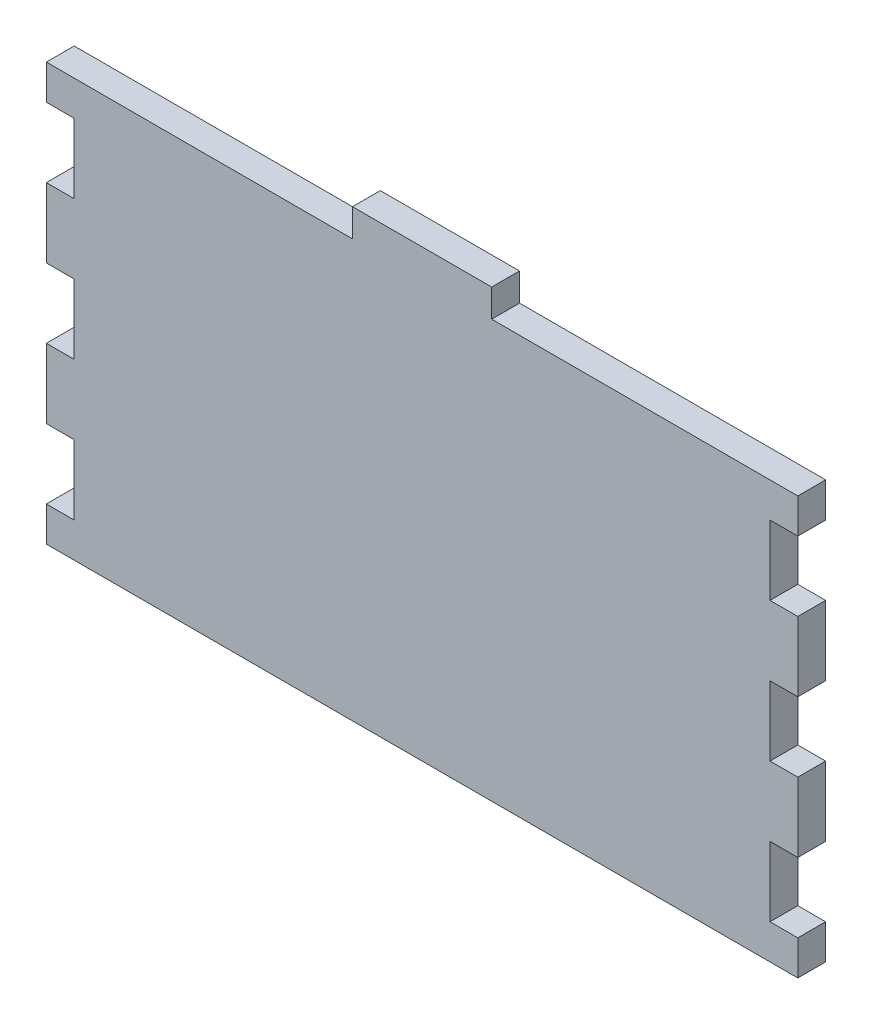
ISO-10303-21;
HEADER;
FILE_DESCRIPTION(('STEP AP214'),'2;1');
FILE_NAME('part.step','',(''),(''),'','','');
FILE_SCHEMA(('AUTOMOTIVE_DESIGN { 1 0 10303 214 1 1 1 1 }'));
ENDSEC;
DATA;
#1=APPLICATION_CONTEXT('core data for automotive mechanical design processes');
#2=APPLICATION_PROTOCOL_DEFINITION('international standard','automotive_design',2000,#1);
#3=PRODUCT_CONTEXT('',#1,'mechanical');
#4=PRODUCT('Part','Part','',(#3));
#5=PRODUCT_RELATED_PRODUCT_CATEGORY('part','',(#4));
#6=PRODUCT_DEFINITION_FORMATION('','',#4);
#7=PRODUCT_DEFINITION_CONTEXT('part definition',#1,'design');
#8=PRODUCT_DEFINITION('design','',#6,#7);
#9=PRODUCT_DEFINITION_SHAPE('','',#8);
#10=(LENGTH_UNIT() NAMED_UNIT(*) SI_UNIT(.MILLI.,.METRE.));
#11=(NAMED_UNIT(*) PLANE_ANGLE_UNIT() SI_UNIT($,.RADIAN.));
#12=(NAMED_UNIT(*) SI_UNIT($,.STERADIAN.) SOLID_ANGLE_UNIT());
#13=UNCERTAINTY_MEASURE_WITH_UNIT(LENGTH_MEASURE(1.E-05),#10,'distance_accuracy_value','');
#14=(GEOMETRIC_REPRESENTATION_CONTEXT(3) GLOBAL_UNCERTAINTY_ASSIGNED_CONTEXT((#13)) GLOBAL_UNIT_ASSIGNED_CONTEXT((#10,
#11,#12)) REPRESENTATION_CONTEXT('',''));
#15=CARTESIAN_POINT('',(0.,0.,0.));
#16=DIRECTION('',(0.,0.,1.));
#17=DIRECTION('',(1.,0.,0.));
#18=AXIS2_PLACEMENT_3D('',#15,#16,#17);
#19=CARTESIAN_POINT('',(0.,30.,4.));
#20=DIRECTION('',(0.,1.,0.));
#21=DIRECTION('',(0.,0.,1.));
#22=AXIS2_PLACEMENT_3D('',#19,#20,#21);
#23=PLANE('',#22);
#24=DIRECTION('',(1.,0.,0.));
#25=VECTOR('',#24,1.);
#26=CARTESIAN_POINT('',(0.,30.,0.));
#27=LINE('',#26,#25);
#28=CARTESIAN_POINT('',(9.99999999999999,30.,0.));
#29=VERTEX_POINT('',#28);
#30=CARTESIAN_POINT('',(54.,30.,0.));
#31=VERTEX_POINT('',#30);
#32=EDGE_CURVE('E396',#29,#31,#27,.T.);
#33=ORIENTED_EDGE('',*,*,#32,.F.);
#34=DIRECTION('',(0.,0.,1.));
#35=VECTOR('',#34,1.);
#36=CARTESIAN_POINT('',(9.99999999999999,30.,0.));
#37=LINE('',#36,#35);
#38=CARTESIAN_POINT('',(9.99999999999999,30.,4.));
#39=VERTEX_POINT('',#38);
#40=EDGE_CURVE('E348',#29,#39,#37,.T.);
#41=ORIENTED_EDGE('',*,*,#40,.T.);
#42=DIRECTION('',(1.,0.,0.));
#43=VECTOR('',#42,1.);
#44=CARTESIAN_POINT('',(0.,30.,4.));
#45=LINE('',#44,#43);
#46=CARTESIAN_POINT('',(54.,30.,4.));
#47=VERTEX_POINT('',#46);
#48=EDGE_CURVE('E303',#39,#47,#45,.T.);
#49=ORIENTED_EDGE('',*,*,#48,.T.);
#50=DIRECTION('',(0.,0.,-1.));
#51=VECTOR('',#50,1.);
#52=CARTESIAN_POINT('',(54.,30.,4.));
#53=LINE('',#52,#51);
#54=EDGE_CURVE('E403',#47,#31,#53,.T.);
#55=ORIENTED_EDGE('',*,*,#54,.T.);
#56=EDGE_LOOP('',(#33,#41,#49,#55));
#57=FACE_BOUND('',#56,.T.);
#58=ADVANCED_FACE('F41',(#57),#23,.T.);
#59=CARTESIAN_POINT('',(0.,-30.,4.));
#60=DIRECTION('',(0.,1.,0.));
#61=DIRECTION('',(0.,0.,1.));
#62=AXIS2_PLACEMENT_3D('',#59,#60,#61);
#63=PLANE('',#62);
#64=DIRECTION('',(1.,0.,0.));
#65=VECTOR('',#64,1.);
#66=CARTESIAN_POINT('',(0.,-30.,0.));
#67=LINE('',#66,#65);
#68=CARTESIAN_POINT('',(-54.,-30.,0.));
#69=VERTEX_POINT('',#68);
#70=CARTESIAN_POINT('',(54.,-30.,0.));
#71=VERTEX_POINT('',#70);
#72=EDGE_CURVE('E363',#69,#71,#67,.T.);
#73=ORIENTED_EDGE('',*,*,#72,.T.);
#74=DIRECTION('',(0.,0.,-1.));
#75=VECTOR('',#74,1.);
#76=CARTESIAN_POINT('',(54.,-30.,4.));
#77=LINE('',#76,#75);
#78=CARTESIAN_POINT('',(54.,-30.,4.));
#79=VERTEX_POINT('',#78);
#80=EDGE_CURVE('E11',#79,#71,#77,.T.);
#81=ORIENTED_EDGE('',*,*,#80,.F.);
#82=DIRECTION('',(1.,0.,0.));
#83=VECTOR('',#82,1.);
#84=CARTESIAN_POINT('',(0.,-30.,4.));
#85=LINE('',#84,#83);
#86=CARTESIAN_POINT('',(-54.,-30.,4.));
#87=VERTEX_POINT('',#86);
#88=EDGE_CURVE('E344',#87,#79,#85,.T.);
#89=ORIENTED_EDGE('',*,*,#88,.F.);
#90=DIRECTION('',(0.,0.,-1.));
#91=VECTOR('',#90,1.);
#92=CARTESIAN_POINT('',(-54.,-30.,4.));
#93=LINE('',#92,#91);
#94=EDGE_CURVE('E66',#87,#69,#93,.T.);
#95=ORIENTED_EDGE('',*,*,#94,.T.);
#96=EDGE_LOOP('',(#73,#81,#89,#95));
#97=FACE_BOUND('',#96,.T.);
#98=ADVANCED_FACE('F43',(#97),#63,.F.);
#99=CARTESIAN_POINT('',(53.9999999999999,1.49880108324396E-13,4.));
#100=DIRECTION('',(-1.,0.,0.));
#101=DIRECTION('',(0.,-1.,0.));
#102=AXIS2_PLACEMENT_3D('',#99,#100,#101);
#103=PLANE('',#102);
#104=DIRECTION('',(0.,1.,0.));
#105=VECTOR('',#104,1.);
#106=CARTESIAN_POINT('',(53.9999999999999,1.49880108324396E-13,0.));
#107=LINE('',#106,#105);
#108=CARTESIAN_POINT('',(54.,-25.,0.));
#109=VERTEX_POINT('',#108);
#110=EDGE_CURVE('E540',#71,#109,#107,.T.);
#111=ORIENTED_EDGE('',*,*,#110,.T.);
#112=DIRECTION('',(0.,0.,-1.));
#113=VECTOR('',#112,1.);
#114=CARTESIAN_POINT('',(54.,-25.,4.));
#115=LINE('',#114,#113);
#116=CARTESIAN_POINT('',(54.,-25.,4.));
#117=VERTEX_POINT('',#116);
#118=EDGE_CURVE('E50',#117,#109,#115,.T.);
#119=ORIENTED_EDGE('',*,*,#118,.F.);
#120=DIRECTION('',(0.,1.,0.));
#121=VECTOR('',#120,1.);
#122=CARTESIAN_POINT('',(53.9999999999999,1.49880108324396E-13,4.));
#123=LINE('',#122,#121);
#124=EDGE_CURVE('E165',#79,#117,#123,.T.);
#125=ORIENTED_EDGE('',*,*,#124,.F.);
#126=ORIENTED_EDGE('',*,*,#80,.T.);
#127=EDGE_LOOP('',(#111,#119,#125,#126));
#128=FACE_BOUND('',#127,.T.);
#129=ADVANCED_FACE('F541',(#128),#103,.F.);
#130=CARTESIAN_POINT('',(0.,-25.,4.));
#131=DIRECTION('',(0.,1.,0.));
#132=DIRECTION('',(0.,0.,1.));
#133=AXIS2_PLACEMENT_3D('',#130,#131,#132);
#134=PLANE('',#133);
#135=DIRECTION('',(1.,0.,0.));
#136=VECTOR('',#135,1.);
#137=CARTESIAN_POINT('',(0.,-25.,0.));
#138=LINE('',#137,#136);
#139=CARTESIAN_POINT('',(50.,-25.,0.));
#140=VERTEX_POINT('',#139);
#141=EDGE_CURVE('E538',#140,#109,#138,.T.);
#142=ORIENTED_EDGE('',*,*,#141,.F.);
#143=DIRECTION('',(0.,0.,-1.));
#144=VECTOR('',#143,1.);
#145=CARTESIAN_POINT('',(50.,-25.,4.));
#146=LINE('',#145,#144);
#147=CARTESIAN_POINT('',(50.,-25.,4.));
#148=VERTEX_POINT('',#147);
#149=EDGE_CURVE('E530',#148,#140,#146,.T.);
#150=ORIENTED_EDGE('',*,*,#149,.F.);
#151=DIRECTION('',(1.,0.,0.));
#152=VECTOR('',#151,1.);
#153=CARTESIAN_POINT('',(0.,-25.,4.));
#154=LINE('',#153,#152);
#155=EDGE_CURVE('E338',#148,#117,#154,.T.);
#156=ORIENTED_EDGE('',*,*,#155,.T.);
#157=ORIENTED_EDGE('',*,*,#118,.T.);
#158=EDGE_LOOP('',(#142,#150,#156,#157));
#159=FACE_BOUND('',#158,.T.);
#160=ADVANCED_FACE('F536',(#159),#134,.T.);
#161=CARTESIAN_POINT('',(50.,0.,4.));
#162=DIRECTION('',(-1.,0.,0.));
#163=DIRECTION('',(0.,0.,1.));
#164=AXIS2_PLACEMENT_3D('',#161,#162,#163);
#165=PLANE('',#164);
#166=DIRECTION('',(0.,1.,0.));
#167=VECTOR('',#166,1.);
#168=CARTESIAN_POINT('',(50.,0.,0.));
#169=LINE('',#168,#167);
#170=CARTESIAN_POINT('',(50.,-15.,0.));
#171=VERTEX_POINT('',#170);
#172=EDGE_CURVE('E547',#140,#171,#169,.T.);
#173=ORIENTED_EDGE('',*,*,#172,.T.);
#174=DIRECTION('',(0.,0.,-1.));
#175=VECTOR('',#174,1.);
#176=CARTESIAN_POINT('',(50.,-15.,4.));
#177=LINE('',#176,#175);
#178=CARTESIAN_POINT('',(50.,-15.,4.));
#179=VERTEX_POINT('',#178);
#180=EDGE_CURVE('E526',#179,#171,#177,.T.);
#181=ORIENTED_EDGE('',*,*,#180,.F.);
#182=DIRECTION('',(0.,1.,0.));
#183=VECTOR('',#182,1.);
#184=CARTESIAN_POINT('',(50.,0.,4.));
#185=LINE('',#184,#183);
#186=EDGE_CURVE('E335',#148,#179,#185,.T.);
#187=ORIENTED_EDGE('',*,*,#186,.F.);
#188=ORIENTED_EDGE('',*,*,#149,.T.);
#189=EDGE_LOOP('',(#173,#181,#187,#188));
#190=FACE_BOUND('',#189,.T.);
#191=ADVANCED_FACE('F627',(#190),#165,.F.);
#192=CARTESIAN_POINT('',(0.,-15.,4.));
#193=DIRECTION('',(0.,1.,0.));
#194=DIRECTION('',(0.,0.,1.));
#195=AXIS2_PLACEMENT_3D('',#192,#193,#194);
#196=PLANE('',#195);
#197=DIRECTION('',(1.,0.,0.));
#198=VECTOR('',#197,1.);
#199=CARTESIAN_POINT('',(0.,-15.,0.));
#200=LINE('',#199,#198);
#201=CARTESIAN_POINT('',(54.,-15.,0.));
#202=VERTEX_POINT('',#201);
#203=EDGE_CURVE('E551',#171,#202,#200,.T.);
#204=ORIENTED_EDGE('',*,*,#203,.T.);
#205=DIRECTION('',(0.,0.,-1.));
#206=VECTOR('',#205,1.);
#207=CARTESIAN_POINT('',(54.,-15.,4.));
#208=LINE('',#207,#206);
#209=CARTESIAN_POINT('',(54.,-15.,4.));
#210=VERTEX_POINT('',#209);
#211=EDGE_CURVE('E523',#210,#202,#208,.T.);
#212=ORIENTED_EDGE('',*,*,#211,.F.);
#213=DIRECTION('',(1.,0.,0.));
#214=VECTOR('',#213,1.);
#215=CARTESIAN_POINT('',(0.,-15.,4.));
#216=LINE('',#215,#214);
#217=EDGE_CURVE('E332',#179,#210,#216,.T.);
#218=ORIENTED_EDGE('',*,*,#217,.F.);
#219=ORIENTED_EDGE('',*,*,#180,.T.);
#220=EDGE_LOOP('',(#204,#212,#218,#219));
#221=FACE_BOUND('',#220,.T.);
#222=ADVANCED_FACE('F623',(#221),#196,.F.);
#223=CARTESIAN_POINT('',(54.,0.,4.));
#224=DIRECTION('',(1.,0.,0.));
#225=DIRECTION('',(0.,1.,0.));
#226=AXIS2_PLACEMENT_3D('',#223,#224,#225);
#227=PLANE('',#226);
#228=DIRECTION('',(0.,-1.,0.));
#229=VECTOR('',#228,1.);
#230=CARTESIAN_POINT('',(54.,0.,0.));
#231=LINE('',#230,#229);
#232=CARTESIAN_POINT('',(54.,-4.99999999999999,0.));
#233=VERTEX_POINT('',#232);
#234=EDGE_CURVE('E560',#233,#202,#231,.T.);
#235=ORIENTED_EDGE('',*,*,#234,.F.);
#236=DIRECTION('',(0.,0.,-1.));
#237=VECTOR('',#236,1.);
#238=CARTESIAN_POINT('',(54.,-4.99999999999999,4.));
#239=LINE('',#238,#237);
#240=CARTESIAN_POINT('',(54.,-4.99999999999999,4.));
#241=VERTEX_POINT('',#240);
#242=EDGE_CURVE('E520',#241,#233,#239,.T.);
#243=ORIENTED_EDGE('',*,*,#242,.F.);
#244=DIRECTION('',(0.,-1.,0.));
#245=VECTOR('',#244,1.);
#246=CARTESIAN_POINT('',(54.,0.,4.));
#247=LINE('',#246,#245);
#248=EDGE_CURVE('E328',#241,#210,#247,.T.);
#249=ORIENTED_EDGE('',*,*,#248,.T.);
#250=ORIENTED_EDGE('',*,*,#211,.T.);
#251=EDGE_LOOP('',(#235,#243,#249,#250));
#252=FACE_BOUND('',#251,.T.);
#253=ADVANCED_FACE('F619',(#252),#227,.T.);
#254=CARTESIAN_POINT('',(0.,-4.99999999999999,4.));
#255=DIRECTION('',(0.,1.,0.));
#256=DIRECTION('',(0.,0.,1.));
#257=AXIS2_PLACEMENT_3D('',#254,#255,#256);
#258=PLANE('',#257);
#259=DIRECTION('',(1.,0.,0.));
#260=VECTOR('',#259,1.);
#261=CARTESIAN_POINT('',(0.,-4.99999999999999,0.));
#262=LINE('',#261,#260);
#263=CARTESIAN_POINT('',(50.,-4.99999999999999,0.));
#264=VERTEX_POINT('',#263);
#265=EDGE_CURVE('E564',#264,#233,#262,.T.);
#266=ORIENTED_EDGE('',*,*,#265,.F.);
#267=DIRECTION('',(0.,0.,-1.));
#268=VECTOR('',#267,1.);
#269=CARTESIAN_POINT('',(50.,-4.99999999999999,4.));
#270=LINE('',#269,#268);
#271=CARTESIAN_POINT('',(50.,-4.99999999999999,4.));
#272=VERTEX_POINT('',#271);
#273=EDGE_CURVE('E517',#272,#264,#270,.T.);
#274=ORIENTED_EDGE('',*,*,#273,.F.);
#275=DIRECTION('',(1.,0.,0.));
#276=VECTOR('',#275,1.);
#277=CARTESIAN_POINT('',(0.,-4.99999999999999,4.));
#278=LINE('',#277,#276);
#279=EDGE_CURVE('E324',#272,#241,#278,.T.);
#280=ORIENTED_EDGE('',*,*,#279,.T.);
#281=ORIENTED_EDGE('',*,*,#242,.T.);
#282=EDGE_LOOP('',(#266,#274,#280,#281));
#283=FACE_BOUND('',#282,.T.);
#284=ADVANCED_FACE('F616',(#283),#258,.T.);
#285=CARTESIAN_POINT('',(50.,5.00000000000001,0.));
#286=VERTEX_POINT('',#285);
#287=EDGE_CURVE('E554',#264,#286,#169,.T.);
#288=ORIENTED_EDGE('',*,*,#287,.T.);
#289=DIRECTION('',(0.,0.,-1.));
#290=VECTOR('',#289,1.);
#291=CARTESIAN_POINT('',(50.,5.00000000000001,4.));
#292=LINE('',#291,#290);
#293=CARTESIAN_POINT('',(50.,5.00000000000001,4.));
#294=VERTEX_POINT('',#293);
#295=EDGE_CURVE('E513',#294,#286,#292,.T.);
#296=ORIENTED_EDGE('',*,*,#295,.F.);
#297=EDGE_CURVE('E323',#272,#294,#185,.T.);
#298=ORIENTED_EDGE('',*,*,#297,.F.);
#299=ORIENTED_EDGE('',*,*,#273,.T.);
#300=EDGE_LOOP('',(#288,#296,#298,#299));
#301=FACE_BOUND('',#300,.T.);
#302=ADVANCED_FACE('F592',(#301),#165,.F.);
#303=CARTESIAN_POINT('',(0.,5.00000000000001,4.));
#304=DIRECTION('',(0.,1.,0.));
#305=DIRECTION('',(0.,0.,1.));
#306=AXIS2_PLACEMENT_3D('',#303,#304,#305);
#307=PLANE('',#306);
#308=DIRECTION('',(1.,0.,0.));
#309=VECTOR('',#308,1.);
#310=CARTESIAN_POINT('',(0.,5.00000000000001,0.));
#311=LINE('',#310,#309);
#312=CARTESIAN_POINT('',(54.,5.00000000000001,0.));
#313=VERTEX_POINT('',#312);
#314=EDGE_CURVE('E568',#286,#313,#311,.T.);
#315=ORIENTED_EDGE('',*,*,#314,.T.);
#316=DIRECTION('',(0.,0.,-1.));
#317=VECTOR('',#316,1.);
#318=CARTESIAN_POINT('',(54.,5.00000000000001,4.));
#319=LINE('',#318,#317);
#320=CARTESIAN_POINT('',(54.,5.00000000000001,4.));
#321=VERTEX_POINT('',#320);
#322=EDGE_CURVE('E510',#321,#313,#319,.T.);
#323=ORIENTED_EDGE('',*,*,#322,.F.);
#324=DIRECTION('',(1.,0.,0.));
#325=VECTOR('',#324,1.);
#326=CARTESIAN_POINT('',(0.,5.00000000000001,4.));
#327=LINE('',#326,#325);
#328=EDGE_CURVE('E320',#294,#321,#327,.T.);
#329=ORIENTED_EDGE('',*,*,#328,.F.);
#330=ORIENTED_EDGE('',*,*,#295,.T.);
#331=EDGE_LOOP('',(#315,#323,#329,#330));
#332=FACE_BOUND('',#331,.T.);
#333=ADVANCED_FACE('F598',(#332),#307,.F.);
#334=CARTESIAN_POINT('',(54.,0.,4.));
#335=DIRECTION('',(1.,0.,0.));
#336=DIRECTION('',(0.,0.,-1.));
#337=AXIS2_PLACEMENT_3D('',#334,#335,#336);
#338=PLANE('',#337);
#339=DIRECTION('',(0.,-1.,0.));
#340=VECTOR('',#339,1.);
#341=CARTESIAN_POINT('',(54.,0.,0.));
#342=LINE('',#341,#340);
#343=CARTESIAN_POINT('',(54.,15.,0.));
#344=VERTEX_POINT('',#343);
#345=EDGE_CURVE('E572',#344,#313,#342,.T.);
#346=ORIENTED_EDGE('',*,*,#345,.F.);
#347=DIRECTION('',(0.,0.,-1.));
#348=VECTOR('',#347,1.);
#349=CARTESIAN_POINT('',(54.,15.,4.));
#350=LINE('',#349,#348);
#351=CARTESIAN_POINT('',(54.,15.,4.));
#352=VERTEX_POINT('',#351);
#353=EDGE_CURVE('E507',#352,#344,#350,.T.);
#354=ORIENTED_EDGE('',*,*,#353,.F.);
#355=DIRECTION('',(0.,-1.,0.));
#356=VECTOR('',#355,1.);
#357=CARTESIAN_POINT('',(54.,0.,4.));
#358=LINE('',#357,#356);
#359=EDGE_CURVE('E316',#352,#321,#358,.T.);
#360=ORIENTED_EDGE('',*,*,#359,.T.);
#361=ORIENTED_EDGE('',*,*,#322,.T.);
#362=EDGE_LOOP('',(#346,#354,#360,#361));
#363=FACE_BOUND('',#362,.T.);
#364=ADVANCED_FACE('F603',(#363),#338,.T.);
#365=CARTESIAN_POINT('',(0.,15.,4.));
#366=DIRECTION('',(0.,1.,0.));
#367=DIRECTION('',(0.,0.,1.));
#368=AXIS2_PLACEMENT_3D('',#365,#366,#367);
#369=PLANE('',#368);
#370=DIRECTION('',(1.,0.,0.));
#371=VECTOR('',#370,1.);
#372=CARTESIAN_POINT('',(0.,15.,0.));
#373=LINE('',#372,#371);
#374=CARTESIAN_POINT('',(50.,15.,0.));
#375=VERTEX_POINT('',#374);
#376=EDGE_CURVE('E576',#375,#344,#373,.T.);
#377=ORIENTED_EDGE('',*,*,#376,.F.);
#378=DIRECTION('',(0.,0.,-1.));
#379=VECTOR('',#378,1.);
#380=CARTESIAN_POINT('',(50.,15.,4.));
#381=LINE('',#380,#379);
#382=CARTESIAN_POINT('',(50.,15.,4.));
#383=VERTEX_POINT('',#382);
#384=EDGE_CURVE('E504',#383,#375,#381,.T.);
#385=ORIENTED_EDGE('',*,*,#384,.F.);
#386=DIRECTION('',(1.,0.,0.));
#387=VECTOR('',#386,1.);
#388=CARTESIAN_POINT('',(0.,15.,4.));
#389=LINE('',#388,#387);
#390=EDGE_CURVE('E312',#383,#352,#389,.T.);
#391=ORIENTED_EDGE('',*,*,#390,.T.);
#392=ORIENTED_EDGE('',*,*,#353,.T.);
#393=EDGE_LOOP('',(#377,#385,#391,#392));
#394=FACE_BOUND('',#393,.T.);
#395=ADVANCED_FACE('F607',(#394),#369,.T.);
#396=CARTESIAN_POINT('',(50.,25.,0.));
#397=VERTEX_POINT('',#396);
#398=EDGE_CURVE('E553',#375,#397,#169,.T.);
#399=ORIENTED_EDGE('',*,*,#398,.T.);
#400=DIRECTION('',(0.,0.,-1.));
#401=VECTOR('',#400,1.);
#402=CARTESIAN_POINT('',(50.,25.,4.));
#403=LINE('',#402,#401);
#404=CARTESIAN_POINT('',(50.,25.,4.));
#405=VERTEX_POINT('',#404);
#406=EDGE_CURVE('E500',#405,#397,#403,.T.);
#407=ORIENTED_EDGE('',*,*,#406,.F.);
#408=EDGE_CURVE('E311',#383,#405,#185,.T.);
#409=ORIENTED_EDGE('',*,*,#408,.F.);
#410=ORIENTED_EDGE('',*,*,#384,.T.);
#411=EDGE_LOOP('',(#399,#407,#409,#410));
#412=FACE_BOUND('',#411,.T.);
#413=ADVANCED_FACE('F609',(#412),#165,.F.);
#414=CARTESIAN_POINT('',(0.,25.,4.));
#415=DIRECTION('',(0.,1.,0.));
#416=DIRECTION('',(0.,0.,1.));
#417=AXIS2_PLACEMENT_3D('',#414,#415,#416);
#418=PLANE('',#417);
#419=DIRECTION('',(1.,0.,0.));
#420=VECTOR('',#419,1.);
#421=CARTESIAN_POINT('',(0.,25.,0.));
#422=LINE('',#421,#420);
#423=CARTESIAN_POINT('',(54.,25.,0.));
#424=VERTEX_POINT('',#423);
#425=EDGE_CURVE('E413',#397,#424,#422,.T.);
#426=ORIENTED_EDGE('',*,*,#425,.T.);
#427=DIRECTION('',(0.,0.,-1.));
#428=VECTOR('',#427,1.);
#429=CARTESIAN_POINT('',(54.,25.,4.));
#430=LINE('',#429,#428);
#431=CARTESIAN_POINT('',(54.,25.,4.));
#432=VERTEX_POINT('',#431);
#433=EDGE_CURVE('E497',#432,#424,#430,.T.);
#434=ORIENTED_EDGE('',*,*,#433,.F.);
#435=DIRECTION('',(1.,0.,0.));
#436=VECTOR('',#435,1.);
#437=CARTESIAN_POINT('',(0.,25.,4.));
#438=LINE('',#437,#436);
#439=EDGE_CURVE('E308',#405,#432,#438,.T.);
#440=ORIENTED_EDGE('',*,*,#439,.F.);
#441=ORIENTED_EDGE('',*,*,#406,.T.);
#442=EDGE_LOOP('',(#426,#434,#440,#441));
#443=FACE_BOUND('',#442,.T.);
#444=ADVANCED_FACE('F702',(#443),#418,.F.);
#445=CARTESIAN_POINT('',(54.,0.,4.));
#446=DIRECTION('',(1.,0.,0.));
#447=DIRECTION('',(0.,1.,0.));
#448=AXIS2_PLACEMENT_3D('',#445,#446,#447);
#449=PLANE('',#448);
#450=DIRECTION('',(0.,-1.,0.));
#451=VECTOR('',#450,1.);
#452=CARTESIAN_POINT('',(54.,0.,0.));
#453=LINE('',#452,#451);
#454=EDGE_CURVE('E407',#31,#424,#453,.T.);
#455=ORIENTED_EDGE('',*,*,#454,.F.);
#456=ORIENTED_EDGE('',*,*,#54,.F.);
#457=DIRECTION('',(0.,-1.,0.));
#458=VECTOR('',#457,1.);
#459=CARTESIAN_POINT('',(54.,0.,4.));
#460=LINE('',#459,#458);
#461=EDGE_CURVE('E304',#47,#432,#460,.T.);
#462=ORIENTED_EDGE('',*,*,#461,.T.);
#463=ORIENTED_EDGE('',*,*,#433,.T.);
#464=EDGE_LOOP('',(#455,#456,#462,#463));
#465=FACE_BOUND('',#464,.T.);
#466=ADVANCED_FACE('F701',(#465),#449,.T.);
#467=DIRECTION('',(0.,0.,1.));
#468=VECTOR('',#467,1.);
#469=CARTESIAN_POINT('',(-10.,30.,0.));
#470=LINE('',#469,#468);
#471=CARTESIAN_POINT('',(-10.,30.,0.));
#472=VERTEX_POINT('',#471);
#473=CARTESIAN_POINT('',(-10.,30.,4.));
#474=VERTEX_POINT('',#473);
#475=EDGE_CURVE('E359',#472,#474,#470,.T.);
#476=ORIENTED_EDGE('',*,*,#475,.F.);
#477=CARTESIAN_POINT('',(-54.,30.,0.));
#478=VERTEX_POINT('',#477);
#479=EDGE_CURVE('E406',#478,#472,#27,.T.);
#480=ORIENTED_EDGE('',*,*,#479,.F.);
#481=DIRECTION('',(0.,0.,-1.));
#482=VECTOR('',#481,1.);
#483=CARTESIAN_POINT('',(-54.,30.,4.));
#484=LINE('',#483,#482);
#485=CARTESIAN_POINT('',(-54.,30.,4.));
#486=VERTEX_POINT('',#485);
#487=EDGE_CURVE('E492',#486,#478,#484,.T.);
#488=ORIENTED_EDGE('',*,*,#487,.F.);
#489=EDGE_CURVE('E297',#486,#474,#45,.T.);
#490=ORIENTED_EDGE('',*,*,#489,.T.);
#491=EDGE_LOOP('',(#476,#480,#488,#490));
#492=FACE_BOUND('',#491,.T.);
#493=ADVANCED_FACE('F683',(#492),#23,.T.);
#494=CARTESIAN_POINT('',(-54.,0.,4.));
#495=DIRECTION('',(1.,0.,0.));
#496=DIRECTION('',(0.,1.,0.));
#497=AXIS2_PLACEMENT_3D('',#494,#495,#496);
#498=PLANE('',#497);
#499=DIRECTION('',(0.,-1.,0.));
#500=VECTOR('',#499,1.);
#501=CARTESIAN_POINT('',(-54.,0.,0.));
#502=LINE('',#501,#500);
#503=CARTESIAN_POINT('',(-54.,25.,0.));
#504=VERTEX_POINT('',#503);
#505=EDGE_CURVE('E412',#478,#504,#502,.T.);
#506=ORIENTED_EDGE('',*,*,#505,.T.);
#507=DIRECTION('',(0.,0.,-1.));
#508=VECTOR('',#507,1.);
#509=CARTESIAN_POINT('',(-54.,25.,4.));
#510=LINE('',#509,#508);
#511=CARTESIAN_POINT('',(-54.,25.,4.));
#512=VERTEX_POINT('',#511);
#513=EDGE_CURVE('E489',#512,#504,#510,.T.);
#514=ORIENTED_EDGE('',*,*,#513,.F.);
#515=DIRECTION('',(0.,-1.,0.));
#516=VECTOR('',#515,1.);
#517=CARTESIAN_POINT('',(-54.,0.,4.));
#518=LINE('',#517,#516);
#519=EDGE_CURVE('E293',#486,#512,#518,.T.);
#520=ORIENTED_EDGE('',*,*,#519,.F.);
#521=ORIENTED_EDGE('',*,*,#487,.T.);
#522=EDGE_LOOP('',(#506,#514,#520,#521));
#523=FACE_BOUND('',#522,.T.);
#524=ADVANCED_FACE('F718',(#523),#498,.F.);
#525=CARTESIAN_POINT('',(0.,25.,4.));
#526=DIRECTION('',(0.,-1.,0.));
#527=DIRECTION('',(0.,0.,-1.));
#528=AXIS2_PLACEMENT_3D('',#525,#526,#527);
#529=PLANE('',#528);
#530=DIRECTION('',(-1.,0.,0.));
#531=VECTOR('',#530,1.);
#532=CARTESIAN_POINT('',(0.,25.,0.));
#533=LINE('',#532,#531);
#534=CARTESIAN_POINT('',(-50.,25.,0.));
#535=VERTEX_POINT('',#534);
#536=EDGE_CURVE('E420',#535,#504,#533,.T.);
#537=ORIENTED_EDGE('',*,*,#536,.F.);
#538=DIRECTION('',(0.,0.,-1.));
#539=VECTOR('',#538,1.);
#540=CARTESIAN_POINT('',(-50.,25.,4.));
#541=LINE('',#540,#539);
#542=CARTESIAN_POINT('',(-50.,25.,4.));
#543=VERTEX_POINT('',#542);
#544=EDGE_CURVE('E486',#543,#535,#541,.T.);
#545=ORIENTED_EDGE('',*,*,#544,.F.);
#546=DIRECTION('',(-1.,0.,0.));
#547=VECTOR('',#546,1.);
#548=CARTESIAN_POINT('',(0.,25.,4.));
#549=LINE('',#548,#547);
#550=EDGE_CURVE('E286',#543,#512,#549,.T.);
#551=ORIENTED_EDGE('',*,*,#550,.T.);
#552=ORIENTED_EDGE('',*,*,#513,.T.);
#553=EDGE_LOOP('',(#537,#545,#551,#552));
#554=FACE_BOUND('',#553,.T.);
#555=ADVANCED_FACE('F676',(#554),#529,.T.);
#556=CARTESIAN_POINT('',(-50.,0.,4.));
#557=DIRECTION('',(-1.,0.,0.));
#558=DIRECTION('',(0.,0.,1.));
#559=AXIS2_PLACEMENT_3D('',#556,#557,#558);
#560=PLANE('',#559);
#561=DIRECTION('',(0.,1.,0.));
#562=VECTOR('',#561,1.);
#563=CARTESIAN_POINT('',(-50.,0.,0.));
#564=LINE('',#563,#562);
#565=CARTESIAN_POINT('',(-50.,15.,0.));
#566=VERTEX_POINT('',#565);
#567=EDGE_CURVE('E424',#566,#535,#564,.T.);
#568=ORIENTED_EDGE('',*,*,#567,.F.);
#569=DIRECTION('',(0.,0.,-1.));
#570=VECTOR('',#569,1.);
#571=CARTESIAN_POINT('',(-50.,15.,4.));
#572=LINE('',#571,#570);
#573=CARTESIAN_POINT('',(-50.,15.,4.));
#574=VERTEX_POINT('',#573);
#575=EDGE_CURVE('E483',#574,#566,#572,.T.);
#576=ORIENTED_EDGE('',*,*,#575,.F.);
#577=DIRECTION('',(0.,1.,0.));
#578=VECTOR('',#577,1.);
#579=CARTESIAN_POINT('',(-50.,0.,4.));
#580=LINE('',#579,#578);
#581=EDGE_CURVE('E273',#574,#543,#580,.T.);
#582=ORIENTED_EDGE('',*,*,#581,.T.);
#583=ORIENTED_EDGE('',*,*,#544,.T.);
#584=EDGE_LOOP('',(#568,#576,#582,#583));
#585=FACE_BOUND('',#584,.T.);
#586=ADVANCED_FACE('F674',(#585),#560,.T.);
#587=CARTESIAN_POINT('',(0.,15.,4.));
#588=DIRECTION('',(0.,-1.,0.));
#589=DIRECTION('',(0.,0.,-1.));
#590=AXIS2_PLACEMENT_3D('',#587,#588,#589);
#591=PLANE('',#590);
#592=DIRECTION('',(-1.,0.,0.));
#593=VECTOR('',#592,1.);
#594=CARTESIAN_POINT('',(0.,15.,0.));
#595=LINE('',#594,#593);
#596=CARTESIAN_POINT('',(-54.,15.,0.));
#597=VERTEX_POINT('',#596);
#598=EDGE_CURVE('E428',#566,#597,#595,.T.);
#599=ORIENTED_EDGE('',*,*,#598,.T.);
#600=DIRECTION('',(0.,0.,-1.));
#601=VECTOR('',#600,1.);
#602=CARTESIAN_POINT('',(-54.,15.,4.));
#603=LINE('',#602,#601);
#604=CARTESIAN_POINT('',(-54.,15.,4.));
#605=VERTEX_POINT('',#604);
#606=EDGE_CURVE('E479',#605,#597,#603,.T.);
#607=ORIENTED_EDGE('',*,*,#606,.F.);
#608=DIRECTION('',(-1.,0.,0.));
#609=VECTOR('',#608,1.);
#610=CARTESIAN_POINT('',(0.,15.,4.));
#611=LINE('',#610,#609);
#612=EDGE_CURVE('E285',#574,#605,#611,.T.);
#613=ORIENTED_EDGE('',*,*,#612,.F.);
#614=ORIENTED_EDGE('',*,*,#575,.T.);
#615=EDGE_LOOP('',(#599,#607,#613,#614));
#616=FACE_BOUND('',#615,.T.);
#617=ADVANCED_FACE('F727',(#616),#591,.F.);
#618=CARTESIAN_POINT('',(-54.,0.,4.));
#619=DIRECTION('',(1.,0.,0.));
#620=DIRECTION('',(0.,1.,0.));
#621=AXIS2_PLACEMENT_3D('',#618,#619,#620);
#622=PLANE('',#621);
#623=DIRECTION('',(0.,-1.,0.));
#624=VECTOR('',#623,1.);
#625=CARTESIAN_POINT('',(-54.,0.,0.));
#626=LINE('',#625,#624);
#627=CARTESIAN_POINT('',(-54.,5.00000000000001,0.));
#628=VERTEX_POINT('',#627);
#629=EDGE_CURVE('E432',#597,#628,#626,.T.);
#630=ORIENTED_EDGE('',*,*,#629,.T.);
#631=DIRECTION('',(0.,0.,-1.));
#632=VECTOR('',#631,1.);
#633=CARTESIAN_POINT('',(-54.,5.00000000000001,4.));
#634=LINE('',#633,#632);
#635=CARTESIAN_POINT('',(-54.,5.00000000000001,4.));
#636=VERTEX_POINT('',#635);
#637=EDGE_CURVE('E476',#636,#628,#634,.T.);
#638=ORIENTED_EDGE('',*,*,#637,.F.);
#639=DIRECTION('',(0.,-1.,0.));
#640=VECTOR('',#639,1.);
#641=CARTESIAN_POINT('',(-54.,0.,4.));
#642=LINE('',#641,#640);
#643=EDGE_CURVE('E291',#605,#636,#642,.T.);
#644=ORIENTED_EDGE('',*,*,#643,.F.);
#645=ORIENTED_EDGE('',*,*,#606,.T.);
#646=EDGE_LOOP('',(#630,#638,#644,#645));
#647=FACE_BOUND('',#646,.T.);
#648=ADVANCED_FACE('F647',(#647),#622,.F.);
#649=CARTESIAN_POINT('',(0.,5.00000000000002,4.));
#650=DIRECTION('',(0.,-1.,0.));
#651=DIRECTION('',(1.,0.,0.));
#652=AXIS2_PLACEMENT_3D('',#649,#650,#651);
#653=PLANE('',#652);
#654=DIRECTION('',(-1.,0.,0.));
#655=VECTOR('',#654,1.);
#656=CARTESIAN_POINT('',(0.,5.00000000000002,0.));
#657=LINE('',#656,#655);
#658=CARTESIAN_POINT('',(-50.,5.00000000000001,0.));
#659=VERTEX_POINT('',#658);
#660=EDGE_CURVE('E436',#659,#628,#657,.T.);
#661=ORIENTED_EDGE('',*,*,#660,.F.);
#662=DIRECTION('',(0.,0.,-1.));
#663=VECTOR('',#662,1.);
#664=CARTESIAN_POINT('',(-50.,5.00000000000001,4.));
#665=LINE('',#664,#663);
#666=CARTESIAN_POINT('',(-50.,5.00000000000001,4.));
#667=VERTEX_POINT('',#666);
#668=EDGE_CURVE('E473',#667,#659,#665,.T.);
#669=ORIENTED_EDGE('',*,*,#668,.F.);
#670=DIRECTION('',(-1.,0.,0.));
#671=VECTOR('',#670,1.);
#672=CARTESIAN_POINT('',(0.,5.00000000000002,4.));
#673=LINE('',#672,#671);
#674=EDGE_CURVE('E282',#667,#636,#673,.T.);
#675=ORIENTED_EDGE('',*,*,#674,.T.);
#676=ORIENTED_EDGE('',*,*,#637,.T.);
#677=EDGE_LOOP('',(#661,#669,#675,#676));
#678=FACE_BOUND('',#677,.T.);
#679=ADVANCED_FACE('F651',(#678),#653,.T.);
#680=CARTESIAN_POINT('',(-50.,-4.99999999999999,0.));
#681=VERTEX_POINT('',#680);
#682=EDGE_CURVE('E429',#681,#659,#564,.T.);
#683=ORIENTED_EDGE('',*,*,#682,.F.);
#684=DIRECTION('',(0.,0.,-1.));
#685=VECTOR('',#684,1.);
#686=CARTESIAN_POINT('',(-50.,-4.99999999999999,4.));
#687=LINE('',#686,#685);
#688=CARTESIAN_POINT('',(-50.,-4.99999999999999,4.));
#689=VERTEX_POINT('',#688);
#690=EDGE_CURVE('E470',#689,#681,#687,.T.);
#691=ORIENTED_EDGE('',*,*,#690,.F.);
#692=EDGE_CURVE('E272',#689,#667,#580,.T.);
#693=ORIENTED_EDGE('',*,*,#692,.T.);
#694=ORIENTED_EDGE('',*,*,#668,.T.);
#695=EDGE_LOOP('',(#683,#691,#693,#694));
#696=FACE_BOUND('',#695,.T.);
#697=ADVANCED_FACE('F655',(#696),#560,.T.);
#698=CARTESIAN_POINT('',(0.,-4.99999999999997,4.));
#699=DIRECTION('',(0.,-1.,0.));
#700=DIRECTION('',(1.,0.,0.));
#701=AXIS2_PLACEMENT_3D('',#698,#699,#700);
#702=PLANE('',#701);
#703=DIRECTION('',(-1.,0.,0.));
#704=VECTOR('',#703,1.);
#705=CARTESIAN_POINT('',(0.,-4.99999999999997,0.));
#706=LINE('',#705,#704);
#707=CARTESIAN_POINT('',(-54.,-4.99999999999999,0.));
#708=VERTEX_POINT('',#707);
#709=EDGE_CURVE('E440',#681,#708,#706,.T.);
#710=ORIENTED_EDGE('',*,*,#709,.T.);
#711=DIRECTION('',(0.,0.,-1.));
#712=VECTOR('',#711,1.);
#713=CARTESIAN_POINT('',(-54.,-4.99999999999999,4.));
#714=LINE('',#713,#712);
#715=CARTESIAN_POINT('',(-54.,-4.99999999999999,4.));
#716=VERTEX_POINT('',#715);
#717=EDGE_CURVE('E466',#716,#708,#714,.T.);
#718=ORIENTED_EDGE('',*,*,#717,.F.);
#719=DIRECTION('',(-1.,0.,0.));
#720=VECTOR('',#719,1.);
#721=CARTESIAN_POINT('',(0.,-4.99999999999997,4.));
#722=LINE('',#721,#720);
#723=EDGE_CURVE('E281',#689,#716,#722,.T.);
#724=ORIENTED_EDGE('',*,*,#723,.F.);
#725=ORIENTED_EDGE('',*,*,#690,.T.);
#726=EDGE_LOOP('',(#710,#718,#724,#725));
#727=FACE_BOUND('',#726,.T.);
#728=ADVANCED_FACE('F661',(#727),#702,.F.);
#729=CARTESIAN_POINT('',(-54.,0.,4.));
#730=DIRECTION('',(1.,0.,0.));
#731=DIRECTION('',(0.,0.,-1.));
#732=AXIS2_PLACEMENT_3D('',#729,#730,#731);
#733=PLANE('',#732);
#734=DIRECTION('',(0.,-1.,0.));
#735=VECTOR('',#734,1.);
#736=CARTESIAN_POINT('',(-54.,0.,0.));
#737=LINE('',#736,#735);
#738=CARTESIAN_POINT('',(-54.,-15.,0.));
#739=VERTEX_POINT('',#738);
#740=EDGE_CURVE('E443',#708,#739,#737,.T.);
#741=ORIENTED_EDGE('',*,*,#740,.T.);
#742=DIRECTION('',(0.,0.,-1.));
#743=VECTOR('',#742,1.);
#744=CARTESIAN_POINT('',(-54.,-15.,4.));
#745=LINE('',#744,#743);
#746=CARTESIAN_POINT('',(-54.,-15.,4.));
#747=VERTEX_POINT('',#746);
#748=EDGE_CURVE('E463',#747,#739,#745,.T.);
#749=ORIENTED_EDGE('',*,*,#748,.F.);
#750=DIRECTION('',(0.,-1.,0.));
#751=VECTOR('',#750,1.);
#752=CARTESIAN_POINT('',(-54.,0.,4.));
#753=LINE('',#752,#751);
#754=EDGE_CURVE('E275',#716,#747,#753,.T.);
#755=ORIENTED_EDGE('',*,*,#754,.F.);
#756=ORIENTED_EDGE('',*,*,#717,.T.);
#757=EDGE_LOOP('',(#741,#749,#755,#756));
#758=FACE_BOUND('',#757,.T.);
#759=ADVANCED_FACE('F665',(#758),#733,.F.);
#760=CARTESIAN_POINT('',(0.,-15.,4.));
#761=DIRECTION('',(0.,-1.,0.));
#762=DIRECTION('',(0.,0.,-1.));
#763=AXIS2_PLACEMENT_3D('',#760,#761,#762);
#764=PLANE('',#763);
#765=DIRECTION('',(-1.,0.,0.));
#766=VECTOR('',#765,1.);
#767=CARTESIAN_POINT('',(0.,-15.,0.));
#768=LINE('',#767,#766);
#769=CARTESIAN_POINT('',(-50.,-15.,0.));
#770=VERTEX_POINT('',#769);
#771=EDGE_CURVE('E447',#770,#739,#768,.T.);
#772=ORIENTED_EDGE('',*,*,#771,.F.);
#773=DIRECTION('',(0.,0.,-1.));
#774=VECTOR('',#773,1.);
#775=CARTESIAN_POINT('',(-50.,-15.,4.));
#776=LINE('',#775,#774);
#777=CARTESIAN_POINT('',(-50.,-15.,4.));
#778=VERTEX_POINT('',#777);
#779=EDGE_CURVE('E255',#778,#770,#776,.T.);
#780=ORIENTED_EDGE('',*,*,#779,.F.);
#781=DIRECTION('',(-1.,0.,0.));
#782=VECTOR('',#781,1.);
#783=CARTESIAN_POINT('',(0.,-15.,4.));
#784=LINE('',#783,#782);
#785=EDGE_CURVE('E269',#778,#747,#784,.T.);
#786=ORIENTED_EDGE('',*,*,#785,.T.);
#787=ORIENTED_EDGE('',*,*,#748,.T.);
#788=EDGE_LOOP('',(#772,#780,#786,#787));
#789=FACE_BOUND('',#788,.T.);
#790=ADVANCED_FACE('F668',(#789),#764,.T.);
#791=CARTESIAN_POINT('',(-50.,-25.,0.));
#792=VERTEX_POINT('',#791);
#793=EDGE_CURVE('E250',#792,#770,#564,.T.);
#794=ORIENTED_EDGE('',*,*,#793,.F.);
#795=DIRECTION('',(0.,0.,-1.));
#796=VECTOR('',#795,1.);
#797=CARTESIAN_POINT('',(-50.,-25.,4.));
#798=LINE('',#797,#796);
#799=CARTESIAN_POINT('',(-50.,-25.,4.));
#800=VERTEX_POINT('',#799);
#801=EDGE_CURVE('E244',#800,#792,#798,.T.);
#802=ORIENTED_EDGE('',*,*,#801,.F.);
#803=EDGE_CURVE('E248',#800,#778,#580,.T.);
#804=ORIENTED_EDGE('',*,*,#803,.T.);
#805=ORIENTED_EDGE('',*,*,#779,.T.);
#806=EDGE_LOOP('',(#794,#802,#804,#805));
#807=FACE_BOUND('',#806,.T.);
#808=ADVANCED_FACE('F246',(#807),#560,.T.);
#809=CARTESIAN_POINT('',(0.,-25.,4.));
#810=DIRECTION('',(0.,-1.,0.));
#811=DIRECTION('',(0.,0.,-1.));
#812=AXIS2_PLACEMENT_3D('',#809,#810,#811);
#813=PLANE('',#812);
#814=DIRECTION('',(-1.,0.,0.));
#815=VECTOR('',#814,1.);
#816=CARTESIAN_POINT('',(0.,-25.,0.));
#817=LINE('',#816,#815);
#818=CARTESIAN_POINT('',(-54.,-25.,0.));
#819=VERTEX_POINT('',#818);
#820=EDGE_CURVE('E451',#792,#819,#817,.T.);
#821=ORIENTED_EDGE('',*,*,#820,.T.);
#822=DIRECTION('',(0.,0.,-1.));
#823=VECTOR('',#822,1.);
#824=CARTESIAN_POINT('',(-54.,-25.,4.));
#825=LINE('',#824,#823);
#826=CARTESIAN_POINT('',(-54.,-25.,4.));
#827=VERTEX_POINT('',#826);
#828=EDGE_CURVE('E256',#827,#819,#825,.T.);
#829=ORIENTED_EDGE('',*,*,#828,.F.);
#830=DIRECTION('',(-1.,0.,0.));
#831=VECTOR('',#830,1.);
#832=CARTESIAN_POINT('',(0.,-25.,4.));
#833=LINE('',#832,#831);
#834=EDGE_CURVE('E259',#800,#827,#833,.T.);
#835=ORIENTED_EDGE('',*,*,#834,.F.);
#836=ORIENTED_EDGE('',*,*,#801,.T.);
#837=EDGE_LOOP('',(#821,#829,#835,#836));
#838=FACE_BOUND('',#837,.T.);
#839=ADVANCED_FACE('F260',(#838),#813,.F.);
#840=CARTESIAN_POINT('',(-54.,0.,4.));
#841=DIRECTION('',(-1.,0.,0.));
#842=DIRECTION('',(0.,0.,1.));
#843=AXIS2_PLACEMENT_3D('',#840,#841,#842);
#844=PLANE('',#843);
#845=DIRECTION('',(0.,1.,0.));
#846=VECTOR('',#845,1.);
#847=CARTESIAN_POINT('',(-54.,0.,0.));
#848=LINE('',#847,#846);
#849=EDGE_CURVE('E347',#69,#819,#848,.T.);
#850=ORIENTED_EDGE('',*,*,#849,.F.);
#851=ORIENTED_EDGE('',*,*,#94,.F.);
#852=DIRECTION('',(0.,1.,0.));
#853=VECTOR('',#852,1.);
#854=CARTESIAN_POINT('',(-54.,0.,4.));
#855=LINE('',#854,#853);
#856=EDGE_CURVE('E264',#87,#827,#855,.T.);
#857=ORIENTED_EDGE('',*,*,#856,.T.);
#858=ORIENTED_EDGE('',*,*,#828,.T.);
#859=EDGE_LOOP('',(#850,#851,#857,#858));
#860=FACE_BOUND('',#859,.T.);
#861=ADVANCED_FACE('F744',(#860),#844,.T.);
#862=CARTESIAN_POINT('',(0.,0.,4.));
#863=DIRECTION('',(0.,0.,1.));
#864=DIRECTION('',(1.,0.,0.));
#865=AXIS2_PLACEMENT_3D('',#862,#863,#864);
#866=PLANE('',#865);
#867=ORIENTED_EDGE('',*,*,#88,.T.);
#868=ORIENTED_EDGE('',*,*,#124,.T.);
#869=ORIENTED_EDGE('',*,*,#155,.F.);
#870=ORIENTED_EDGE('',*,*,#186,.T.);
#871=ORIENTED_EDGE('',*,*,#217,.T.);
#872=ORIENTED_EDGE('',*,*,#248,.F.);
#873=ORIENTED_EDGE('',*,*,#279,.F.);
#874=ORIENTED_EDGE('',*,*,#297,.T.);
#875=ORIENTED_EDGE('',*,*,#328,.T.);
#876=ORIENTED_EDGE('',*,*,#359,.F.);
#877=ORIENTED_EDGE('',*,*,#390,.F.);
#878=ORIENTED_EDGE('',*,*,#408,.T.);
#879=ORIENTED_EDGE('',*,*,#439,.T.);
#880=ORIENTED_EDGE('',*,*,#461,.F.);
#881=ORIENTED_EDGE('',*,*,#48,.F.);
#882=DIRECTION('',(0.,1.,0.));
#883=VECTOR('',#882,1.);
#884=CARTESIAN_POINT('',(9.99999999999999,0.,4.));
#885=LINE('',#884,#883);
#886=CARTESIAN_POINT('',(9.99999999999999,34.,4.));
#887=VERTEX_POINT('',#886);
#888=EDGE_CURVE('E57',#39,#887,#885,.T.);
#889=ORIENTED_EDGE('',*,*,#888,.T.);
#890=DIRECTION('',(1.,0.,0.));
#891=VECTOR('',#890,1.);
#892=CARTESIAN_POINT('',(0.,34.,4.));
#893=LINE('',#892,#891);
#894=CARTESIAN_POINT('',(-10.,34.,4.));
#895=VERTEX_POINT('',#894);
#896=EDGE_CURVE('E369',#895,#887,#893,.T.);
#897=ORIENTED_EDGE('',*,*,#896,.F.);
#898=DIRECTION('',(0.,1.,0.));
#899=VECTOR('',#898,1.);
#900=CARTESIAN_POINT('',(-10.,0.,4.));
#901=LINE('',#900,#899);
#902=EDGE_CURVE('E364',#474,#895,#901,.T.);
#903=ORIENTED_EDGE('',*,*,#902,.F.);
#904=ORIENTED_EDGE('',*,*,#489,.F.);
#905=ORIENTED_EDGE('',*,*,#519,.T.);
#906=ORIENTED_EDGE('',*,*,#550,.F.);
#907=ORIENTED_EDGE('',*,*,#581,.F.);
#908=ORIENTED_EDGE('',*,*,#612,.T.);
#909=ORIENTED_EDGE('',*,*,#643,.T.);
#910=ORIENTED_EDGE('',*,*,#674,.F.);
#911=ORIENTED_EDGE('',*,*,#692,.F.);
#912=ORIENTED_EDGE('',*,*,#723,.T.);
#913=ORIENTED_EDGE('',*,*,#754,.T.);
#914=ORIENTED_EDGE('',*,*,#785,.F.);
#915=ORIENTED_EDGE('',*,*,#803,.F.);
#916=ORIENTED_EDGE('',*,*,#834,.T.);
#917=ORIENTED_EDGE('',*,*,#856,.F.);
#918=EDGE_LOOP('',(#867,#868,#869,#870,#871,#872,#873,#874,#875,#876,#877,#878,#879,#880,#881,
#889,#897,#903,#904,#905,#906,#907,#908,#909,#910,#911,#912,#913,#914,#915,#916,#917));
#919=FACE_BOUND('',#918,.T.);
#920=ADVANCED_FACE('F267',(#919),#866,.T.);
#921=CARTESIAN_POINT('',(0.,0.,0.));
#922=DIRECTION('',(0.,0.,1.));
#923=DIRECTION('',(1.,0.,0.));
#924=AXIS2_PLACEMENT_3D('',#921,#922,#923);
#925=PLANE('',#924);
#926=ORIENTED_EDGE('',*,*,#72,.F.);
#927=ORIENTED_EDGE('',*,*,#849,.T.);
#928=ORIENTED_EDGE('',*,*,#820,.F.);
#929=ORIENTED_EDGE('',*,*,#793,.T.);
#930=ORIENTED_EDGE('',*,*,#771,.T.);
#931=ORIENTED_EDGE('',*,*,#740,.F.);
#932=ORIENTED_EDGE('',*,*,#709,.F.);
#933=ORIENTED_EDGE('',*,*,#682,.T.);
#934=ORIENTED_EDGE('',*,*,#660,.T.);
#935=ORIENTED_EDGE('',*,*,#629,.F.);
#936=ORIENTED_EDGE('',*,*,#598,.F.);
#937=ORIENTED_EDGE('',*,*,#567,.T.);
#938=ORIENTED_EDGE('',*,*,#536,.T.);
#939=ORIENTED_EDGE('',*,*,#505,.F.);
#940=ORIENTED_EDGE('',*,*,#479,.T.);
#941=DIRECTION('',(0.,1.,0.));
#942=VECTOR('',#941,1.);
#943=CARTESIAN_POINT('',(-10.,0.,0.));
#944=LINE('',#943,#942);
#945=CARTESIAN_POINT('',(-10.,34.,0.));
#946=VERTEX_POINT('',#945);
#947=EDGE_CURVE('E352',#472,#946,#944,.T.);
#948=ORIENTED_EDGE('',*,*,#947,.T.);
#949=DIRECTION('',(1.,0.,0.));
#950=VECTOR('',#949,1.);
#951=CARTESIAN_POINT('',(0.,34.,0.));
#952=LINE('',#951,#950);
#953=CARTESIAN_POINT('',(9.99999999999999,34.,0.));
#954=VERTEX_POINT('',#953);
#955=EDGE_CURVE('E378',#946,#954,#952,.T.);
#956=ORIENTED_EDGE('',*,*,#955,.T.);
#957=DIRECTION('',(0.,1.,0.));
#958=VECTOR('',#957,1.);
#959=CARTESIAN_POINT('',(9.99999999999999,0.,0.));
#960=LINE('',#959,#958);
#961=EDGE_CURVE('E368',#29,#954,#960,.T.);
#962=ORIENTED_EDGE('',*,*,#961,.F.);
#963=ORIENTED_EDGE('',*,*,#32,.T.);
#964=ORIENTED_EDGE('',*,*,#454,.T.);
#965=ORIENTED_EDGE('',*,*,#425,.F.);
#966=ORIENTED_EDGE('',*,*,#398,.F.);
#967=ORIENTED_EDGE('',*,*,#376,.T.);
#968=ORIENTED_EDGE('',*,*,#345,.T.);
#969=ORIENTED_EDGE('',*,*,#314,.F.);
#970=ORIENTED_EDGE('',*,*,#287,.F.);
#971=ORIENTED_EDGE('',*,*,#265,.T.);
#972=ORIENTED_EDGE('',*,*,#234,.T.);
#973=ORIENTED_EDGE('',*,*,#203,.F.);
#974=ORIENTED_EDGE('',*,*,#172,.F.);
#975=ORIENTED_EDGE('',*,*,#141,.T.);
#976=ORIENTED_EDGE('',*,*,#110,.F.);
#977=EDGE_LOOP('',(#926,#927,#928,#929,#930,#931,#932,#933,#934,#935,#936,#937,#938,#939,#940,
#948,#956,#962,#963,#964,#965,#966,#967,#968,#969,#970,#971,#972,#973,#974,#975,#976));
#978=FACE_BOUND('',#977,.T.);
#979=ADVANCED_FACE('F394',(#978),#925,.F.);
#980=CARTESIAN_POINT('',(-10.,0.,0.));
#981=DIRECTION('',(1.,0.,0.));
#982=DIRECTION('',(0.,0.,-1.));
#983=AXIS2_PLACEMENT_3D('',#980,#981,#982);
#984=PLANE('',#983);
#985=ORIENTED_EDGE('',*,*,#902,.T.);
#986=DIRECTION('',(0.,0.,1.));
#987=VECTOR('',#986,1.);
#988=CARTESIAN_POINT('',(-10.,34.,0.));
#989=LINE('',#988,#987);
#990=EDGE_CURVE('E355',#946,#895,#989,.T.);
#991=ORIENTED_EDGE('',*,*,#990,.F.);
#992=ORIENTED_EDGE('',*,*,#947,.F.);
#993=ORIENTED_EDGE('',*,*,#475,.T.);
#994=EDGE_LOOP('',(#985,#991,#992,#993));
#995=FACE_BOUND('',#994,.T.);
#996=ADVANCED_FACE('F689',(#995),#984,.F.);
#997=CARTESIAN_POINT('',(0.,34.,0.));
#998=DIRECTION('',(0.,-1.,0.));
#999=DIRECTION('',(0.,0.,-1.));
#1000=AXIS2_PLACEMENT_3D('',#997,#998,#999);
#1001=PLANE('',#1000);
#1002=ORIENTED_EDGE('',*,*,#896,.T.);
#1003=DIRECTION('',(0.,0.,1.));
#1004=VECTOR('',#1003,1.);
#1005=CARTESIAN_POINT('',(9.99999999999999,34.,0.));
#1006=LINE('',#1005,#1004);
#1007=EDGE_CURVE('E351',#954,#887,#1006,.T.);
#1008=ORIENTED_EDGE('',*,*,#1007,.F.);
#1009=ORIENTED_EDGE('',*,*,#955,.F.);
#1010=ORIENTED_EDGE('',*,*,#990,.T.);
#1011=EDGE_LOOP('',(#1002,#1008,#1009,#1010));
#1012=FACE_BOUND('',#1011,.T.);
#1013=ADVANCED_FACE('F697',(#1012),#1001,.F.);
#1014=CARTESIAN_POINT('',(9.99999999999999,0.,0.));
#1015=DIRECTION('',(1.,0.,0.));
#1016=DIRECTION('',(0.,0.,-1.));
#1017=AXIS2_PLACEMENT_3D('',#1014,#1015,#1016);
#1018=PLANE('',#1017);
#1019=ORIENTED_EDGE('',*,*,#888,.F.);
#1020=ORIENTED_EDGE('',*,*,#40,.F.);
#1021=ORIENTED_EDGE('',*,*,#961,.T.);
#1022=ORIENTED_EDGE('',*,*,#1007,.T.);
#1023=EDGE_LOOP('',(#1019,#1020,#1021,#1022));
#1024=FACE_BOUND('',#1023,.T.);
#1025=ADVANCED_FACE('F386',(#1024),#1018,.T.);
#1026=CLOSED_SHELL('',(#58,#98,#129,#160,#191,#222,#253,#284,#302,#333,#364,#395,#413,#444,#466,
#493,#524,#555,#586,#617,#648,#679,#697,#728,#759,#790,#808,#839,#861,#920,#979,#996,#1013,#1025));
#1027=MANIFOLD_SOLID_BREP('B2',#1026);
#1028=ADVANCED_BREP_SHAPE_REPRESENTATION('',(#18,#1027),#14);
#1029=SHAPE_DEFINITION_REPRESENTATION(#9,#1028);
ENDSEC;
END-ISO-10303-21;
